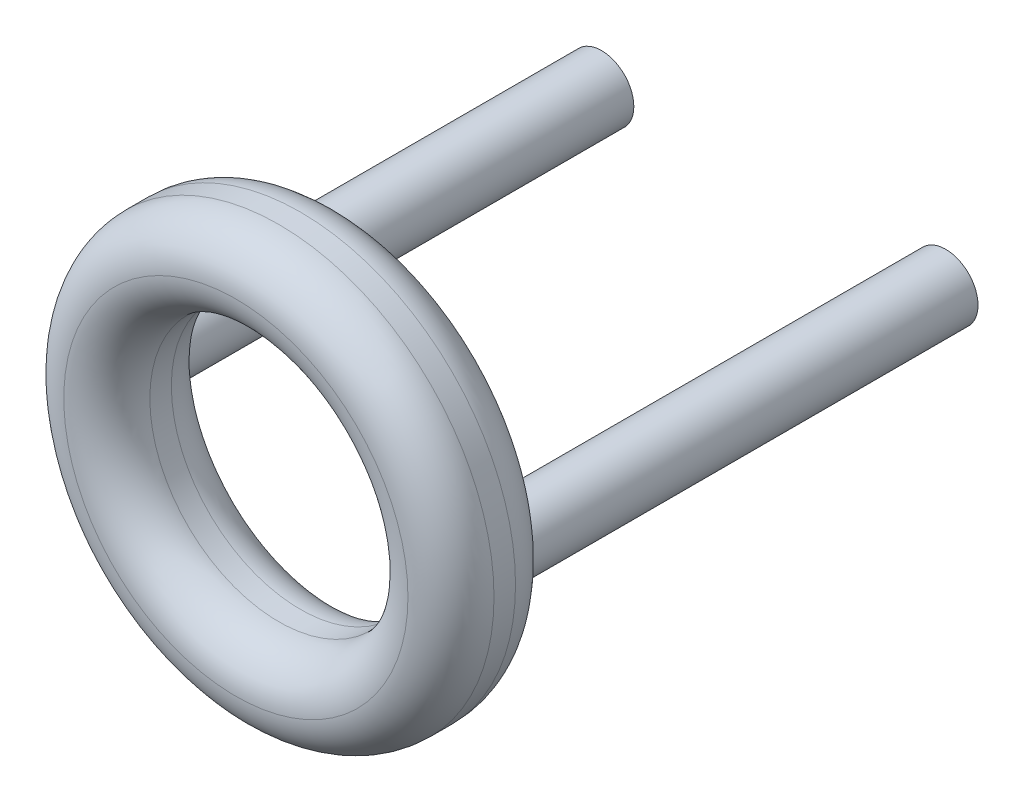
ISO-10303-21;
HEADER;
FILE_DESCRIPTION(('STEP AP214'),'2;1');
FILE_NAME('part.step','',(''),(''),'','','');
FILE_SCHEMA(('AUTOMOTIVE_DESIGN { 1 0 10303 214 1 1 1 1 }'));
ENDSEC;
DATA;
#1=APPLICATION_CONTEXT('core data for automotive mechanical design processes');
#2=APPLICATION_PROTOCOL_DEFINITION('international standard','automotive_design',2000,#1);
#3=PRODUCT_CONTEXT('',#1,'mechanical');
#4=PRODUCT('Part','Part','',(#3));
#5=PRODUCT_RELATED_PRODUCT_CATEGORY('part','',(#4));
#6=PRODUCT_DEFINITION_FORMATION('','',#4);
#7=PRODUCT_DEFINITION_CONTEXT('part definition',#1,'design');
#8=PRODUCT_DEFINITION('design','',#6,#7);
#9=PRODUCT_DEFINITION_SHAPE('','',#8);
#10=(LENGTH_UNIT() NAMED_UNIT(*) SI_UNIT(.MILLI.,.METRE.));
#11=(NAMED_UNIT(*) PLANE_ANGLE_UNIT() SI_UNIT($,.RADIAN.));
#12=(NAMED_UNIT(*) SI_UNIT($,.STERADIAN.) SOLID_ANGLE_UNIT());
#13=UNCERTAINTY_MEASURE_WITH_UNIT(LENGTH_MEASURE(1.E-05),#10,'distance_accuracy_value','');
#14=(GEOMETRIC_REPRESENTATION_CONTEXT(3) GLOBAL_UNCERTAINTY_ASSIGNED_CONTEXT((#13)) GLOBAL_UNIT_ASSIGNED_CONTEXT((#10,
#11,#12)) REPRESENTATION_CONTEXT('',''));
#15=CARTESIAN_POINT('',(0.,0.,0.));
#16=DIRECTION('',(0.,0.,1.));
#17=DIRECTION('',(1.,0.,0.));
#18=AXIS2_PLACEMENT_3D('',#15,#16,#17);
#19=CARTESIAN_POINT('',(0.,0.,25.));
#20=DIRECTION('',(0.,0.,-1.));
#21=DIRECTION('',(-1.,0.,0.));
#22=AXIS2_PLACEMENT_3D('',#19,#20,#21);
#23=CYLINDRICAL_SURFACE('',#22,50.);
#24=CARTESIAN_POINT('',(0.,0.,10.));
#25=DIRECTION('',(0.,0.,1.));
#26=DIRECTION('',(1.,0.,0.));
#27=AXIS2_PLACEMENT_3D('',#24,#25,#26);
#28=CIRCLE('',#27,50.);
#29=CARTESIAN_POINT('',(50.,0.,10.));
#30=VERTEX_POINT('',#29);
#31=EDGE_CURVE('E82',#30,#30,#28,.T.);
#32=ORIENTED_EDGE('',*,*,#31,.T.);
#33=EDGE_LOOP('',(#32));
#34=FACE_BOUND('',#33,.T.);
#35=CARTESIAN_POINT('',(0.,0.,15.));
#36=DIRECTION('',(0.,0.,1.));
#37=DIRECTION('',(1.,0.,0.));
#38=AXIS2_PLACEMENT_3D('',#35,#36,#37);
#39=CIRCLE('',#38,50.);
#40=CARTESIAN_POINT('',(50.,0.,15.));
#41=VERTEX_POINT('',#40);
#42=EDGE_CURVE('E149',#41,#41,#39,.F.);
#43=ORIENTED_EDGE('',*,*,#42,.T.);
#44=EDGE_LOOP('',(#43));
#45=FACE_BOUND('',#44,.T.);
#46=ADVANCED_FACE('F37',(#34,#45),#23,.T.);
#47=CARTESIAN_POINT('',(0.,0.,25.));
#48=DIRECTION('',(0.,0.,-1.));
#49=DIRECTION('',(-1.,0.,0.));
#50=AXIS2_PLACEMENT_3D('',#47,#48,#49);
#51=CYLINDRICAL_SURFACE('',#50,30.);
#52=CARTESIAN_POINT('',(0.,0.,10.));
#53=DIRECTION('',(0.,0.,1.));
#54=DIRECTION('',(1.,0.,0.));
#55=AXIS2_PLACEMENT_3D('',#52,#53,#54);
#56=CIRCLE('',#55,30.);
#57=CARTESIAN_POINT('',(30.,0.,10.));
#58=VERTEX_POINT('',#57);
#59=EDGE_CURVE('E74',#58,#58,#56,.F.);
#60=ORIENTED_EDGE('',*,*,#59,.T.);
#61=EDGE_LOOP('',(#60));
#62=FACE_BOUND('',#61,.T.);
#63=CARTESIAN_POINT('',(0.,0.,15.));
#64=DIRECTION('',(0.,0.,1.));
#65=DIRECTION('',(1.,0.,0.));
#66=AXIS2_PLACEMENT_3D('',#63,#64,#65);
#67=CIRCLE('',#66,30.);
#68=CARTESIAN_POINT('',(30.,0.,15.));
#69=VERTEX_POINT('',#68);
#70=EDGE_CURVE('E113',#69,#69,#67,.T.);
#71=ORIENTED_EDGE('',*,*,#70,.T.);
#72=EDGE_LOOP('',(#71));
#73=FACE_BOUND('',#72,.T.);
#74=ADVANCED_FACE('F117',(#62,#73),#51,.F.);
#75=CARTESIAN_POINT('',(-40.,0.,-100.));
#76=DIRECTION('',(0.,0.,1.));
#77=DIRECTION('',(1.,0.,0.));
#78=AXIS2_PLACEMENT_3D('',#75,#76,#77);
#79=CYLINDRICAL_SURFACE('',#78,7.5);
#80=CARTESIAN_POINT('',(-40.,0.,-100.));
#81=DIRECTION('',(0.,0.,1.));
#82=DIRECTION('',(1.,0.,0.));
#83=AXIS2_PLACEMENT_3D('',#80,#81,#82);
#84=CIRCLE('',#83,7.5);
#85=CARTESIAN_POINT('',(-32.5,0.,-100.));
#86=VERTEX_POINT('',#85);
#87=EDGE_CURVE('E152',#86,#86,#84,.T.);
#88=ORIENTED_EDGE('',*,*,#87,.T.);
#89=EDGE_LOOP('',(#88));
#90=FACE_BOUND('',#89,.T.);
#91=CARTESIAN_POINT('',(-39.296875,-7.46696827597218,0.));
#92=CARTESIAN_POINT('',(-39.4828433615517,-7.48452035154865,-3.83736356607891E-05));
#93=CARTESIAN_POINT('',(-39.6694359226315,-7.49504297331925,0.00518662248186173));
#94=CARTESIAN_POINT('',(-40.0422081473934,-7.50218514104267,0.0256502324255281));
#95=CARTESIAN_POINT('',(-40.2283880123181,-7.49881475823574,0.0408815857674367));
#96=CARTESIAN_POINT('',(-40.5977340455147,-7.478418737152,0.0807153281178335));
#97=CARTESIAN_POINT('',(-40.7809119656611,-7.46148267927572,0.105255687655519));
#98=CARTESIAN_POINT('',(-41.1441980802517,-7.41446943515852,0.163007286180664));
#99=CARTESIAN_POINT('',(-41.3243058351975,-7.3843903836237,0.196219755671169));
#100=CARTESIAN_POINT('',(-41.6797672765103,-7.3117160747166,0.270405288826198));
#101=CARTESIAN_POINT('',(-41.8551333411666,-7.26915773115464,0.311355339415414));
#102=CARTESIAN_POINT('',(-42.2007467341656,-7.17209695269338,0.400218388743584));
#103=CARTESIAN_POINT('',(-42.3709920310473,-7.11758984685219,0.44813410798763));
#104=CARTESIAN_POINT('',(-42.8731608600823,-6.93696161584904,0.601110308175253));
#105=CARTESIAN_POINT('',(-43.1963212135659,-6.79377461951817,0.715357387661439));
#106=CARTESIAN_POINT('',(-43.8435226612275,-6.45166796679128,0.972658450696581));
#107=CARTESIAN_POINT('',(-44.1647333694752,-6.24874713316809,1.11741772069651));
#108=CARTESIAN_POINT('',(-44.7699640229752,-5.79995331741055,1.41853360360408));
#109=CARTESIAN_POINT('',(-45.0539521421047,-5.55404399299704,1.57489996421992));
#110=CARTESIAN_POINT('',(-45.4720202747004,-5.13370342325031,1.8242629999697));
#111=CARTESIAN_POINT('',(-45.6194310501645,-4.97191604403373,1.91665016049628));
#112=CARTESIAN_POINT('',(-45.8999612275101,-4.63556029229111,2.10009533434255));
#113=CARTESIAN_POINT('',(-46.033077644282,-4.46098926289136,2.19115306661884));
#114=CARTESIAN_POINT('',(-46.2842239903363,-4.09962289171252,2.36960079504635));
#115=CARTESIAN_POINT('',(-46.4022593561802,-3.91283199199395,2.45699210523071));
#116=CARTESIAN_POINT('',(-46.6223677476853,-3.52753686773058,2.62549412969762));
#117=CARTESIAN_POINT('',(-46.7244462617831,-3.32903670314386,2.70660699861291));
#118=CARTESIAN_POINT('',(-46.9572389891968,-2.82102756588989,2.89696032566588));
#119=CARTESIAN_POINT('',(-47.077720913079,-2.50449820659589,3.00068444738192));
#120=CARTESIAN_POINT('',(-47.2265217586658,-2.01410141598239,3.13246557141737));
#121=CARTESIAN_POINT('',(-47.2707933201478,-1.84808677564434,3.17241680154093));
#122=CARTESIAN_POINT('',(-47.3481248233084,-1.51156087905157,3.24302160601089));
#123=CARTESIAN_POINT('',(-47.3811907911044,-1.34105209299326,3.27368017680174));
#124=CARTESIAN_POINT('',(-47.4358042817862,-0.994897396909216,3.32470609913635));
#125=CARTESIAN_POINT('',(-47.457234576801,-0.819217347511331,3.34496860352389));
#126=CARTESIAN_POINT('',(-47.4876204018837,-0.46581559637232,3.37379197625345));
#127=CARTESIAN_POINT('',(-47.4965763179319,-0.288093957973303,3.38235320665439));
#128=CARTESIAN_POINT('',(-47.5018039075852,0.0676611734173048,3.38734373365225));
#129=CARTESIAN_POINT('',(-47.4980788697896,0.245694573589969,3.38377617565363));
#130=CARTESIAN_POINT('',(-47.4780399936094,0.600392767856604,3.36469665473796));
#131=CARTESIAN_POINT('',(-47.4617266906087,0.777057619832734,3.34918519979969));
#132=CARTESIAN_POINT('',(-47.4198109437094,1.10452901468007,3.30973685409011));
#133=CARTESIAN_POINT('',(-47.3957018311239,1.25569650991975,3.28716666577849));
#134=CARTESIAN_POINT('',(-47.3386112331969,1.55500065313595,3.23433796676222));
#135=CARTESIAN_POINT('',(-47.3056265391811,1.7031361841238,3.20407667581237));
#136=CARTESIAN_POINT('',(-47.1939212455017,2.14209430047592,3.1030511223141));
#137=CARTESIAN_POINT('',(-47.1024512495441,2.42745463056976,3.02204697524747));
#138=CARTESIAN_POINT('',(-46.9188160266286,2.90271621755152,2.86590111872612));
#139=CARTESIAN_POINT('',(-46.8339147967494,3.09709940166745,2.79539115833151));
#140=CARTESIAN_POINT('',(-46.6492804035443,3.47583351745239,2.64691056184396));
#141=CARTESIAN_POINT('',(-46.5495416498972,3.66018063192564,2.56893711770603));
#142=CARTESIAN_POINT('',(-46.3360048397099,4.01853617634076,2.40786002827181));
#143=CARTESIAN_POINT('',(-46.2221868608313,4.192529428038,2.32474919857934));
#144=CARTESIAN_POINT('',(-45.9813108142928,4.52954856380252,2.15562259361708));
#145=CARTESIAN_POINT('',(-45.8542541306777,4.69257559141074,2.06960712264821));
#146=CARTESIAN_POINT('',(-45.5850757317455,5.01009135091931,1.89500131707354));
#147=CARTESIAN_POINT('',(-45.4427263713907,5.1643767956071,1.80639239126276));
#148=CARTESIAN_POINT('',(-45.1453804445496,5.46068763031003,1.62989953176074));
#149=CARTESIAN_POINT('',(-44.9903840834748,5.60271321937153,1.54201558631995));
#150=CARTESIAN_POINT('',(-44.6683034632097,5.87377382549731,1.36870290037893));
#151=CARTESIAN_POINT('',(-44.5012259839927,6.00281603312335,1.28327281980185));
#152=CARTESIAN_POINT('',(-44.1554207715133,6.24718261797653,1.11644885427996));
#153=CARTESIAN_POINT('',(-43.9766939635559,6.36250808267264,1.035054649668));
#154=CARTESIAN_POINT('',(-43.6272575189247,6.56731824300382,0.886043969206347));
#155=CARTESIAN_POINT('',(-43.4576273999268,6.65824170074795,0.817872856976212));
#156=CARTESIAN_POINT('',(-43.1101381208038,6.82747133482234,0.687284647566088));
#157=CARTESIAN_POINT('',(-42.9322826448453,6.90578309086092,0.624865011058986));
#158=CARTESIAN_POINT('',(-42.5693134518762,7.04887349765397,0.507041737898746));
#159=CARTESIAN_POINT('',(-42.3842121583237,7.11367420246447,0.451626726776997));
#160=CARTESIAN_POINT('',(-42.0075102201615,7.22901642959214,0.348911005161536));
#161=CARTESIAN_POINT('',(-41.8159128030983,7.27956491999605,0.301606333870003));
#162=CARTESIAN_POINT('',(-41.434847362526,7.36395303031043,0.217894985643583));
#163=CARTESIAN_POINT('',(-41.2455833531836,7.39836304124707,0.181137707376988));
#164=CARTESIAN_POINT('',(-40.8634237241821,7.45263319299253,0.117140476000725));
#165=CARTESIAN_POINT('',(-40.6705288644972,7.47249634462468,0.0898985540694818));
#166=CARTESIAN_POINT('',(-40.281012601454,7.49729225763067,0.0455887158806521));
#167=CARTESIAN_POINT('',(-40.08437377285,7.50210528200673,0.0286032551439178));
#168=CARTESIAN_POINT('',(-39.7890775717675,7.49768188151459,0.0115049225675571));
#169=CARTESIAN_POINT('',(-39.6905316700791,7.49426153326768,0.00720206137772249));
#170=CARTESIAN_POINT('',(-39.4935601407121,7.48353182313152,0.00144869026197761));
#171=CARTESIAN_POINT('',(-39.39513452416,7.47622212528213,-1.57320707648197E-06));
#172=CARTESIAN_POINT('',(-39.296875,7.46696827597218,0.));
#173=B_SPLINE_CURVE_WITH_KNOTS('',3,(#91,#92,#93,#94,#95,#96,#97,#98,#99,#100,#101,#102,#103,
#104,#105,#106,#107,#108,#109,#110,#111,#112,#113,#114,#115,#116,#117,#118,#119,#120,#121,#122,
#123,#124,#125,#126,#127,#128,#129,#130,#131,#132,#133,#134,#135,#136,#137,#138,#139,#140,#141,
#142,#143,#144,#145,#146,#147,#148,#149,#150,#151,#152,#153,#154,#155,#156,#157,#158,#159,#160,
#161,#162,#163,#164,#165,#166,#167,#168,#169,#170,#171,#172),.UNSPECIFIED.,.F.,.F.,(4,2,2,2,2,2,
2,2,2,2,2,2,2,2,2,2,2,2,2,2,2,2,2,2,2,2,2,2,2,2,2,2,2,2,2,2,2,2,2,2,4),(0.,0.560122047304853,
1.11983812545812,1.67588831337038,2.23201744327294,2.78651785524334,3.34123541712019,
4.4512783076623,5.66673003393851,6.88321431118526,7.59526570617166,8.30746551178006,
9.01940784803233,9.73110476688772,10.7890763127844,11.3177493963032,11.8461377184201,
12.3797551086666,12.9133559874363,13.4468184960332,13.9802583175058,14.4439551699429,
14.9078198824655,15.8355909191397,16.5054136119204,17.1754893154097,17.8465242726619,
18.5174891465984,19.2003809133729,19.8832615908901,20.5657619636599,21.2482081914038,
21.8601455114556,22.4718113480801,23.0824708095778,23.6928311922202,24.2795962038086,
24.8662397358794,25.4575388108966,25.7535334235083,26.0495536081442),.UNSPECIFIED.);
#174=CARTESIAN_POINT('',(-39.296875,-7.46696827597218,0.));
#175=VERTEX_POINT('',#174);
#176=CARTESIAN_POINT('',(-39.296875,7.46696827597218,0.));
#177=VERTEX_POINT('',#176);
#178=EDGE_CURVE('E58',#175,#177,#173,.T.);
#179=ORIENTED_EDGE('',*,*,#178,.T.);
#180=CARTESIAN_POINT('',(-39.296875,7.46696827597218,0.));
#181=CARTESIAN_POINT('',(-39.1161426886276,7.44998980399375,-4.23041557231891E-05));
#182=CARTESIAN_POINT('',(-38.9360476822339,7.42637325083257,0.00489719738267642));
#183=CARTESIAN_POINT('',(-38.5786488142297,7.36630286492063,0.0246328822237953));
#184=CARTESIAN_POINT('',(-38.4013436105896,7.32985541476325,0.0394241681182077));
#185=CARTESIAN_POINT('',(-38.0520528744001,7.24483512673809,0.0786226182207418));
#186=CARTESIAN_POINT('',(-37.8800393214081,7.19634662349656,0.102963557542882));
#187=CARTESIAN_POINT('',(-37.5413095940661,7.08776882851818,0.160881100178214));
#188=CARTESIAN_POINT('',(-37.3745937816466,7.0276787461614,0.194458332989054));
#189=CARTESIAN_POINT('',(-37.047830572793,6.89678354130436,0.270215604022961));
#190=CARTESIAN_POINT('',(-36.8877714954644,6.82599829356909,0.312379734793604));
#191=CARTESIAN_POINT('',(-36.5747652067918,6.6744303529777,0.404647873817085));
#192=CARTESIAN_POINT('',(-36.4218211370909,6.59364330038335,0.454755347222345));
#193=CARTESIAN_POINT('',(-36.1236201894087,6.42286756106054,0.562104372747657));
#194=CARTESIAN_POINT('',(-35.9783693976574,6.33287174944967,0.619351456443668));
#195=CARTESIAN_POINT('',(-35.6960816512706,6.14451718687103,0.740038567526594));
#196=CARTESIAN_POINT('',(-35.5590464428001,6.04615666871169,0.803479903979907));
#197=CARTESIAN_POINT('',(-35.2481397196032,5.80692061821335,0.958133257654476));
#198=CARTESIAN_POINT('',(-35.0776494669823,5.66298833276817,1.05143590567543));
#199=CARTESIAN_POINT('',(-34.7521786368705,5.3627816461185,1.24501673075821));
#200=CARTESIAN_POINT('',(-34.5972033170722,5.20650309290009,1.34529725309565));
#201=CARTESIAN_POINT('',(-34.3021975801722,4.88194081297046,1.55068096155294));
#202=CARTESIAN_POINT('',(-34.1622322657151,4.71360968450253,1.65580253590255));
#203=CARTESIAN_POINT('',(-33.8979578096703,4.36608959260525,1.86766255514281));
#204=CARTESIAN_POINT('',(-33.7736467490338,4.18690196406671,1.97440080004571));
#205=CARTESIAN_POINT('',(-33.5382793521879,3.81389811546805,2.18854897154051));
#206=CARTESIAN_POINT('',(-33.4275522882225,3.61985522544088,2.29592673240065));
#207=CARTESIAN_POINT('',(-33.2227284660258,3.2201006271461,2.50510238755272));
#208=CARTESIAN_POINT('',(-33.1286400709198,3.01438311907274,2.60689745817372));
#209=CARTESIAN_POINT('',(-32.9585426137403,2.59217696859957,2.79917407786933));
#210=CARTESIAN_POINT('',(-32.8824268271388,2.37576163908277,2.88972081690656));
#211=CARTESIAN_POINT('',(-32.749153914221,1.93103862395094,3.05378657646959));
#212=CARTESIAN_POINT('',(-32.6919685023627,1.70274927640134,3.12733095167242));
#213=CARTESIAN_POINT('',(-32.6206068813276,1.34554136823321,3.22122661503682));
#214=CARTESIAN_POINT('',(-32.5988529711124,1.22039441658589,3.25032622611199));
#215=CARTESIAN_POINT('',(-32.5615872187039,0.967633155219642,3.30065521814179));
#216=CARTESIAN_POINT('',(-32.5460727400452,0.840019911570272,3.32188792295031));
#217=CARTESIAN_POINT('',(-32.5215985531011,0.583201586367572,3.35557081750956));
#218=CARTESIAN_POINT('',(-32.5126290027413,0.453999193308049,3.36803419331138));
#219=CARTESIAN_POINT('',(-32.5014059681678,0.194731988989297,3.38365092580545));
#220=CARTESIAN_POINT('',(-32.4991525249047,0.0646671724763827,3.38680422573055));
#221=CARTESIAN_POINT('',(-32.5014178392176,-0.19547480018109,3.38364328786888));
#222=CARTESIAN_POINT('',(-32.5059464034875,-0.325551701710495,3.37731534031631));
#223=CARTESIAN_POINT('',(-32.5216862953839,-0.584512801651907,3.35547464917599));
#224=CARTESIAN_POINT('',(-32.5328976884509,-0.713396988371893,3.33996181564672));
#225=CARTESIAN_POINT('',(-32.5617830512127,-0.96929662383673,3.30042661951817));
#226=CARTESIAN_POINT('',(-32.5794664152454,-1.0963090754734,3.27639188861796));
#227=CARTESIAN_POINT('',(-32.6209789318803,-1.34770035429008,3.22077748103988));
#228=CARTESIAN_POINT('',(-32.6448117745101,-1.47207755151274,3.18919327509969));
#229=CARTESIAN_POINT('',(-32.710202415566,-1.77253831521789,3.10404541733885));
#230=CARTESIAN_POINT('',(-32.7549246780635,-1.94694008734821,3.04696176875361));
#231=CARTESIAN_POINT('',(-32.8555130895167,-2.28868250790179,2.92262726423552));
#232=CARTESIAN_POINT('',(-32.9113808114244,-2.45602215560849,2.85537497353304));
#233=CARTESIAN_POINT('',(-33.0337185146037,-2.78418464898494,2.71341388657352));
#234=CARTESIAN_POINT('',(-33.1002222627954,-2.94498462200988,2.63868163580236));
#235=CARTESIAN_POINT('',(-33.2431917512094,-3.25966357177122,2.48444989961629));
#236=CARTESIAN_POINT('',(-33.3196570479666,-3.41354285619062,2.40495062650314));
#237=CARTESIAN_POINT('',(-33.5112546559696,-3.76829856658714,2.21444291952458));
#238=CARTESIAN_POINT('',(-33.6304555688477,-3.96638035615548,2.10230210211001));
#239=CARTESIAN_POINT('',(-33.8864052243653,-4.35054428880397,1.87734613087307));
#240=CARTESIAN_POINT('',(-34.0231602077639,-4.53662212876096,1.76453075089835));
#241=CARTESIAN_POINT('',(-34.313985700548,-4.89618416521348,1.5420013642663));
#242=CARTESIAN_POINT('',(-34.4680303866368,-5.06968652255129,1.43228303081354));
#243=CARTESIAN_POINT('',(-34.7936156489814,-5.40350564448791,1.2190070439338));
#244=CARTESIAN_POINT('',(-34.9651491058279,-5.56382772694256,1.11544691056569));
#245=CARTESIAN_POINT('',(-35.2831008627135,-5.83382464148634,0.940794236562553));
#246=CARTESIAN_POINT('',(-35.4259104462311,-5.9465309084743,0.867801993640989));
#247=CARTESIAN_POINT('',(-35.7214619284487,-6.16259722422036,0.728427520876253));
#248=CARTESIAN_POINT('',(-35.8742014438852,-6.26595950147862,0.662043714565976));
#249=CARTESIAN_POINT('',(-36.1888979194759,-6.46218287905828,0.537227019768857));
#250=CARTESIAN_POINT('',(-36.3508348361398,-6.55506558957844,0.478777716776997));
#251=CARTESIAN_POINT('',(-36.6834740246763,-6.7294798286677,0.370819827992916));
#252=CARTESIAN_POINT('',(-36.8541717882149,-6.81101711699145,0.321306701731864));
#253=CARTESIAN_POINT('',(-37.2046542830465,-6.96223427439103,0.231870836498628));
#254=CARTESIAN_POINT('',(-37.3844931521091,-7.03182928329618,0.19201596530391));
#255=CARTESIAN_POINT('',(-37.7508558788783,-7.15743323990798,0.12315079764103));
#256=CARTESIAN_POINT('',(-37.9373790918652,-7.21344349386804,0.0941394583587798));
#257=CARTESIAN_POINT('',(-38.3174777426869,-7.31149732703702,0.0472716475570189));
#258=CARTESIAN_POINT('',(-38.511104665283,-7.35339737584432,0.0295282742686749));
#259=CARTESIAN_POINT('',(-38.8041050994161,-7.40470784545471,0.0117987572718843));
#260=CARTESIAN_POINT('',(-38.9022485887133,-7.41989279722667,0.00736985357594758));
#261=CARTESIAN_POINT('',(-39.0991524640816,-7.44636437289765,0.0014695897001808));
#262=CARTESIAN_POINT('',(-39.1979128755881,-7.45765083497027,-1.64771905834302E-06));
#263=CARTESIAN_POINT('',(-39.296875,-7.46696827597218,0.));
#264=B_SPLINE_CURVE_WITH_KNOTS('',3,(#180,#181,#182,#183,#184,#185,#186,#187,#188,#189,#190,
#191,#192,#193,#194,#195,#196,#197,#198,#199,#200,#201,#202,#203,#204,#205,#206,#207,#208,#209,
#210,#211,#212,#213,#214,#215,#216,#217,#218,#219,#220,#221,#222,#223,#224,#225,#226,#227,#228,
#229,#230,#231,#232,#233,#234,#235,#236,#237,#238,#239,#240,#241,#242,#243,#244,#245,#246,#247,
#248,#249,#250,#251,#252,#253,#254,#255,#256,#257,#258,#259,#260,#261,#262,#263),.UNSPECIFIED.,
.F.,.F.,(4,2,2,2,2,2,2,2,2,2,2,2,2,2,2,2,2,2,2,2,2,2,2,2,2,2,2,2,2,2,2,2,2,2,2,2,2,2,2,2,2,4),
(0.,0.544375589475484,1.08848076684839,1.62887755122925,2.16931117536911,2.70875259333029,
3.24842998459188,3.7885281314709,4.32874066842187,5.05324056405254,5.77798515262442,
6.50575583366609,7.23343721055521,7.97624614665752,8.7194273875271,9.45807778502581,
10.1956194650407,10.5862174681038,10.9766502505363,11.3664946945892,11.7563415156705,
12.1467525946917,12.5371674968141,12.9281513648343,13.3193703926532,13.885087770171,
14.4508850435925,15.0185156149226,15.5861209252864,16.3560073961442,17.1261683362553,
17.8951939249518,18.6639076957604,19.2514507276716,19.8388532614358,20.4250214589565,
21.0108909809251,21.6007651701226,22.1905826169702,22.7862302871671,23.0843541353887,
23.3824903572525),.UNSPECIFIED.);
#265=EDGE_CURVE('E11',#177,#175,#264,.T.);
#266=ORIENTED_EDGE('',*,*,#265,.T.);
#267=EDGE_LOOP('',(#179,#266));
#268=FACE_BOUND('',#267,.T.);
#269=ADVANCED_FACE('F135',(#90,#268),#79,.T.);
#270=CARTESIAN_POINT('',(-40.,0.,-100.));
#271=DIRECTION('',(0.,0.,1.));
#272=DIRECTION('',(1.,0.,0.));
#273=AXIS2_PLACEMENT_3D('',#270,#271,#272);
#274=PLANE('',#273);
#275=ORIENTED_EDGE('',*,*,#87,.F.);
#276=EDGE_LOOP('',(#275));
#277=FACE_BOUND('',#276,.T.);
#278=ADVANCED_FACE('F103',(#277),#274,.F.);
#279=CARTESIAN_POINT('',(40.,0.,-100.));
#280=DIRECTION('',(0.,0.,1.));
#281=DIRECTION('',(1.,0.,0.));
#282=AXIS2_PLACEMENT_3D('',#279,#280,#281);
#283=CYLINDRICAL_SURFACE('',#282,7.5);
#284=CARTESIAN_POINT('',(40.,0.,-100.));
#285=DIRECTION('',(0.,0.,1.));
#286=DIRECTION('',(1.,0.,0.));
#287=AXIS2_PLACEMENT_3D('',#284,#285,#286);
#288=CIRCLE('',#287,7.5);
#289=CARTESIAN_POINT('',(47.5,0.,-100.));
#290=VERTEX_POINT('',#289);
#291=EDGE_CURVE('E156',#290,#290,#288,.T.);
#292=ORIENTED_EDGE('',*,*,#291,.T.);
#293=EDGE_LOOP('',(#292));
#294=FACE_BOUND('',#293,.T.);
#295=CARTESIAN_POINT('',(39.296875,7.46696827597218,0.));
#296=CARTESIAN_POINT('',(39.4828433615517,7.48452035154865,-3.83736356607891E-05));
#297=CARTESIAN_POINT('',(39.6694359226315,7.49504297331925,0.00518662248186173));
#298=CARTESIAN_POINT('',(40.0422081473934,7.50218514104267,0.0256502324255281));
#299=CARTESIAN_POINT('',(40.2283880123181,7.49881475823574,0.0408815857674367));
#300=CARTESIAN_POINT('',(40.5977340455147,7.478418737152,0.0807153281178335));
#301=CARTESIAN_POINT('',(40.7809119656611,7.46148267927572,0.105255687655519));
#302=CARTESIAN_POINT('',(41.1441980802517,7.41446943515852,0.163007286180664));
#303=CARTESIAN_POINT('',(41.3243058351975,7.3843903836237,0.196219755671169));
#304=CARTESIAN_POINT('',(41.6797672765103,7.3117160747166,0.270405288826198));
#305=CARTESIAN_POINT('',(41.8551333411666,7.26915773115464,0.311355339415414));
#306=CARTESIAN_POINT('',(42.2007467341656,7.17209695269338,0.400218388743584));
#307=CARTESIAN_POINT('',(42.3709920310473,7.11758984685219,0.44813410798763));
#308=CARTESIAN_POINT('',(42.8731608600823,6.93696161584904,0.601110308175253));
#309=CARTESIAN_POINT('',(43.1963212135659,6.79377461951817,0.715357387661439));
#310=CARTESIAN_POINT('',(43.8435226612275,6.45166796679128,0.972658450696581));
#311=CARTESIAN_POINT('',(44.1647333694752,6.24874713316809,1.11741772069651));
#312=CARTESIAN_POINT('',(44.7699640229752,5.79995331741055,1.41853360360408));
#313=CARTESIAN_POINT('',(45.0539521421047,5.55404399299704,1.57489996421992));
#314=CARTESIAN_POINT('',(45.4720202747004,5.13370342325031,1.8242629999697));
#315=CARTESIAN_POINT('',(45.6194310501645,4.97191604403373,1.91665016049628));
#316=CARTESIAN_POINT('',(45.8999612275101,4.63556029229111,2.10009533434255));
#317=CARTESIAN_POINT('',(46.033077644282,4.46098926289136,2.19115306661884));
#318=CARTESIAN_POINT('',(46.2842239903363,4.09962289171252,2.36960079504635));
#319=CARTESIAN_POINT('',(46.4022593561802,3.91283199199395,2.45699210523071));
#320=CARTESIAN_POINT('',(46.6223677476853,3.52753686773058,2.62549412969762));
#321=CARTESIAN_POINT('',(46.7244462617831,3.32903670314386,2.70660699861291));
#322=CARTESIAN_POINT('',(46.9572389891968,2.82102756588989,2.89696032566588));
#323=CARTESIAN_POINT('',(47.077720913079,2.50449820659589,3.00068444738192));
#324=CARTESIAN_POINT('',(47.2265217586658,2.01410141598239,3.13246557141737));
#325=CARTESIAN_POINT('',(47.2707933201478,1.84808677564434,3.17241680154093));
#326=CARTESIAN_POINT('',(47.3481248233084,1.51156087905157,3.24302160601089));
#327=CARTESIAN_POINT('',(47.3811907911044,1.34105209299326,3.27368017680174));
#328=CARTESIAN_POINT('',(47.4358042817862,0.994897396909216,3.32470609913635));
#329=CARTESIAN_POINT('',(47.457234576801,0.819217347511331,3.34496860352389));
#330=CARTESIAN_POINT('',(47.4876204018837,0.46581559637232,3.37379197625345));
#331=CARTESIAN_POINT('',(47.4965763179319,0.288093957973303,3.38235320665439));
#332=CARTESIAN_POINT('',(47.5018039075852,-0.0676611734173048,3.38734373365225));
#333=CARTESIAN_POINT('',(47.4980788697896,-0.245694573589969,3.38377617565363));
#334=CARTESIAN_POINT('',(47.4780399936094,-0.600392767856604,3.36469665473796));
#335=CARTESIAN_POINT('',(47.4617266906087,-0.777057619832734,3.34918519979969));
#336=CARTESIAN_POINT('',(47.4198109437094,-1.10452901468007,3.30973685409011));
#337=CARTESIAN_POINT('',(47.3957018311239,-1.25569650991975,3.28716666577849));
#338=CARTESIAN_POINT('',(47.3386112331969,-1.55500065313595,3.23433796676222));
#339=CARTESIAN_POINT('',(47.3056265391811,-1.7031361841238,3.20407667581237));
#340=CARTESIAN_POINT('',(47.1939212455017,-2.14209430047592,3.1030511223141));
#341=CARTESIAN_POINT('',(47.1024512495441,-2.42745463056976,3.02204697524747));
#342=CARTESIAN_POINT('',(46.9188160266286,-2.90271621755152,2.86590111872612));
#343=CARTESIAN_POINT('',(46.8339147967494,-3.09709940166745,2.79539115833151));
#344=CARTESIAN_POINT('',(46.6492804035443,-3.47583351745239,2.64691056184396));
#345=CARTESIAN_POINT('',(46.5495416498972,-3.66018063192564,2.56893711770603));
#346=CARTESIAN_POINT('',(46.3360048397099,-4.01853617634076,2.40786002827181));
#347=CARTESIAN_POINT('',(46.2221868608313,-4.192529428038,2.32474919857934));
#348=CARTESIAN_POINT('',(45.9813108142928,-4.52954856380252,2.15562259361708));
#349=CARTESIAN_POINT('',(45.8542541306777,-4.69257559141074,2.06960712264821));
#350=CARTESIAN_POINT('',(45.5850757317455,-5.01009135091931,1.89500131707354));
#351=CARTESIAN_POINT('',(45.4427263713907,-5.1643767956071,1.80639239126276));
#352=CARTESIAN_POINT('',(45.1453804445496,-5.46068763031003,1.62989953176074));
#353=CARTESIAN_POINT('',(44.9903840834748,-5.60271321937153,1.54201558631995));
#354=CARTESIAN_POINT('',(44.6683034632097,-5.87377382549731,1.36870290037893));
#355=CARTESIAN_POINT('',(44.5012259839927,-6.00281603312335,1.28327281980185));
#356=CARTESIAN_POINT('',(44.1554207715133,-6.24718261797653,1.11644885427996));
#357=CARTESIAN_POINT('',(43.9766939635559,-6.36250808267264,1.035054649668));
#358=CARTESIAN_POINT('',(43.6272575189247,-6.56731824300382,0.886043969206347));
#359=CARTESIAN_POINT('',(43.4576273999268,-6.65824170074795,0.817872856976212));
#360=CARTESIAN_POINT('',(43.1101381208038,-6.82747133482234,0.687284647566088));
#361=CARTESIAN_POINT('',(42.9322826448453,-6.90578309086092,0.624865011058986));
#362=CARTESIAN_POINT('',(42.5693134518762,-7.04887349765397,0.507041737898746));
#363=CARTESIAN_POINT('',(42.3842121583237,-7.11367420246447,0.451626726776997));
#364=CARTESIAN_POINT('',(42.0075102201615,-7.22901642959214,0.348911005161536));
#365=CARTESIAN_POINT('',(41.8159128030983,-7.27956491999605,0.301606333870003));
#366=CARTESIAN_POINT('',(41.434847362526,-7.36395303031043,0.217894985643583));
#367=CARTESIAN_POINT('',(41.2455833531836,-7.39836304124707,0.181137707376988));
#368=CARTESIAN_POINT('',(40.8634237241821,-7.45263319299253,0.117140476000725));
#369=CARTESIAN_POINT('',(40.6705288644972,-7.47249634462468,0.0898985540694818));
#370=CARTESIAN_POINT('',(40.281012601454,-7.49729225763067,0.0455887158806521));
#371=CARTESIAN_POINT('',(40.08437377285,-7.50210528200673,0.0286032551439178));
#372=CARTESIAN_POINT('',(39.7890775717675,-7.49768188151459,0.0115049225675571));
#373=CARTESIAN_POINT('',(39.6905316700791,-7.49426153326768,0.00720206137772249));
#374=CARTESIAN_POINT('',(39.4935601407121,-7.48353182313152,0.00144869026197761));
#375=CARTESIAN_POINT('',(39.39513452416,-7.47622212528213,-1.57320707648197E-06));
#376=CARTESIAN_POINT('',(39.296875,-7.46696827597218,0.));
#377=B_SPLINE_CURVE_WITH_KNOTS('',3,(#295,#296,#297,#298,#299,#300,#301,#302,#303,#304,#305,
#306,#307,#308,#309,#310,#311,#312,#313,#314,#315,#316,#317,#318,#319,#320,#321,#322,#323,#324,
#325,#326,#327,#328,#329,#330,#331,#332,#333,#334,#335,#336,#337,#338,#339,#340,#341,#342,#343,
#344,#345,#346,#347,#348,#349,#350,#351,#352,#353,#354,#355,#356,#357,#358,#359,#360,#361,#362,
#363,#364,#365,#366,#367,#368,#369,#370,#371,#372,#373,#374,#375,#376),.UNSPECIFIED.,.F.,.F.,(4,
2,2,2,2,2,2,2,2,2,2,2,2,2,2,2,2,2,2,2,2,2,2,2,2,2,2,2,2,2,2,2,2,2,2,2,2,2,2,2,4),(0.,
0.560122047304853,1.11983812545812,1.67588831337038,2.23201744327294,2.78651785524334,
3.34123541712019,4.4512783076623,5.66673003393851,6.88321431118526,7.59526570617166,
8.30746551178006,9.01940784803233,9.73110476688772,10.7890763127844,11.3177493963032,
11.8461377184201,12.3797551086666,12.9133559874363,13.4468184960332,13.9802583175058,
14.4439551699429,14.9078198824655,15.8355909191397,16.5054136119204,17.1754893154097,
17.8465242726619,18.5174891465984,19.2003809133729,19.8832615908901,20.5657619636599,
21.2482081914038,21.8601455114556,22.4718113480801,23.0824708095778,23.6928311922202,
24.2795962038086,24.8662397358794,25.4575388108966,25.7535334235083,26.0495536081442),.UNSPECIFIED.);
#378=CARTESIAN_POINT('',(39.296875,7.46696827597218,0.));
#379=VERTEX_POINT('',#378);
#380=CARTESIAN_POINT('',(39.296875,-7.46696827597218,0.));
#381=VERTEX_POINT('',#380);
#382=EDGE_CURVE('E69',#379,#381,#377,.T.);
#383=ORIENTED_EDGE('',*,*,#382,.T.);
#384=CARTESIAN_POINT('',(39.296875,-7.46696827597218,0.));
#385=CARTESIAN_POINT('',(39.1161426886276,-7.44998980399375,-4.23041557231891E-05));
#386=CARTESIAN_POINT('',(38.9360476822339,-7.42637325083257,0.00489719738267642));
#387=CARTESIAN_POINT('',(38.5786488142297,-7.36630286492063,0.0246328822237953));
#388=CARTESIAN_POINT('',(38.4013436105896,-7.32985541476325,0.0394241681182077));
#389=CARTESIAN_POINT('',(38.0520528744001,-7.24483512673809,0.0786226182207418));
#390=CARTESIAN_POINT('',(37.8800393214081,-7.19634662349656,0.102963557542882));
#391=CARTESIAN_POINT('',(37.5413095940661,-7.08776882851818,0.160881100178214));
#392=CARTESIAN_POINT('',(37.3745937816466,-7.0276787461614,0.194458332989054));
#393=CARTESIAN_POINT('',(37.047830572793,-6.89678354130436,0.270215604022961));
#394=CARTESIAN_POINT('',(36.8877714954644,-6.82599829356909,0.312379734793604));
#395=CARTESIAN_POINT('',(36.5747652067918,-6.6744303529777,0.404647873817085));
#396=CARTESIAN_POINT('',(36.4218211370909,-6.59364330038335,0.454755347222345));
#397=CARTESIAN_POINT('',(36.1236201894087,-6.42286756106054,0.562104372747657));
#398=CARTESIAN_POINT('',(35.9783693976574,-6.33287174944967,0.619351456443668));
#399=CARTESIAN_POINT('',(35.6960816512706,-6.14451718687103,0.740038567526594));
#400=CARTESIAN_POINT('',(35.5590464428001,-6.04615666871169,0.803479903979907));
#401=CARTESIAN_POINT('',(35.2481397196032,-5.80692061821335,0.958133257654476));
#402=CARTESIAN_POINT('',(35.0776494669823,-5.66298833276817,1.05143590567543));
#403=CARTESIAN_POINT('',(34.7521786368705,-5.3627816461185,1.24501673075821));
#404=CARTESIAN_POINT('',(34.5972033170722,-5.20650309290009,1.34529725309565));
#405=CARTESIAN_POINT('',(34.3021975801722,-4.88194081297046,1.55068096155294));
#406=CARTESIAN_POINT('',(34.1622322657151,-4.71360968450253,1.65580253590255));
#407=CARTESIAN_POINT('',(33.8979578096703,-4.36608959260525,1.86766255514281));
#408=CARTESIAN_POINT('',(33.7736467490338,-4.18690196406671,1.97440080004571));
#409=CARTESIAN_POINT('',(33.5382793521879,-3.81389811546805,2.18854897154051));
#410=CARTESIAN_POINT('',(33.4275522882225,-3.61985522544088,2.29592673240065));
#411=CARTESIAN_POINT('',(33.2227284660258,-3.2201006271461,2.50510238755272));
#412=CARTESIAN_POINT('',(33.1286400709198,-3.01438311907274,2.60689745817372));
#413=CARTESIAN_POINT('',(32.9585426137403,-2.59217696859957,2.79917407786933));
#414=CARTESIAN_POINT('',(32.8824268271388,-2.37576163908277,2.88972081690656));
#415=CARTESIAN_POINT('',(32.749153914221,-1.93103862395094,3.05378657646959));
#416=CARTESIAN_POINT('',(32.6919685023627,-1.70274927640134,3.12733095167242));
#417=CARTESIAN_POINT('',(32.6206068813276,-1.34554136823321,3.22122661503682));
#418=CARTESIAN_POINT('',(32.5988529711124,-1.22039441658589,3.25032622611199));
#419=CARTESIAN_POINT('',(32.5615872187039,-0.967633155219642,3.30065521814179));
#420=CARTESIAN_POINT('',(32.5460727400452,-0.840019911570272,3.32188792295031));
#421=CARTESIAN_POINT('',(32.5215985531011,-0.583201586367572,3.35557081750956));
#422=CARTESIAN_POINT('',(32.5126290027413,-0.453999193308049,3.36803419331138));
#423=CARTESIAN_POINT('',(32.5014059681678,-0.194731988989297,3.38365092580545));
#424=CARTESIAN_POINT('',(32.4991525249047,-0.0646671724763827,3.38680422573055));
#425=CARTESIAN_POINT('',(32.5014178392176,0.19547480018109,3.38364328786888));
#426=CARTESIAN_POINT('',(32.5059464034875,0.325551701710495,3.37731534031631));
#427=CARTESIAN_POINT('',(32.5216862953839,0.584512801651907,3.35547464917599));
#428=CARTESIAN_POINT('',(32.5328976884509,0.713396988371893,3.33996181564672));
#429=CARTESIAN_POINT('',(32.5617830512127,0.96929662383673,3.30042661951817));
#430=CARTESIAN_POINT('',(32.5794664152454,1.0963090754734,3.27639188861796));
#431=CARTESIAN_POINT('',(32.6209789318803,1.34770035429008,3.22077748103988));
#432=CARTESIAN_POINT('',(32.6448117745101,1.47207755151274,3.18919327509969));
#433=CARTESIAN_POINT('',(32.710202415566,1.77253831521789,3.10404541733885));
#434=CARTESIAN_POINT('',(32.7549246780635,1.94694008734821,3.04696176875361));
#435=CARTESIAN_POINT('',(32.8555130895167,2.28868250790179,2.92262726423552));
#436=CARTESIAN_POINT('',(32.9113808114244,2.45602215560849,2.85537497353304));
#437=CARTESIAN_POINT('',(33.0337185146037,2.78418464898494,2.71341388657352));
#438=CARTESIAN_POINT('',(33.1002222627954,2.94498462200988,2.63868163580236));
#439=CARTESIAN_POINT('',(33.2431917512094,3.25966357177122,2.48444989961629));
#440=CARTESIAN_POINT('',(33.3196570479666,3.41354285619062,2.40495062650314));
#441=CARTESIAN_POINT('',(33.5112546559696,3.76829856658714,2.21444291952458));
#442=CARTESIAN_POINT('',(33.6304555688477,3.96638035615548,2.10230210211001));
#443=CARTESIAN_POINT('',(33.8864052243653,4.35054428880397,1.87734613087307));
#444=CARTESIAN_POINT('',(34.0231602077639,4.53662212876096,1.76453075089835));
#445=CARTESIAN_POINT('',(34.313985700548,4.89618416521348,1.5420013642663));
#446=CARTESIAN_POINT('',(34.4680303866368,5.06968652255129,1.43228303081354));
#447=CARTESIAN_POINT('',(34.7936156489814,5.40350564448791,1.2190070439338));
#448=CARTESIAN_POINT('',(34.9651491058279,5.56382772694256,1.11544691056569));
#449=CARTESIAN_POINT('',(35.2831008627135,5.83382464148634,0.940794236562553));
#450=CARTESIAN_POINT('',(35.4259104462311,5.9465309084743,0.867801993640989));
#451=CARTESIAN_POINT('',(35.7214619284487,6.16259722422036,0.728427520876253));
#452=CARTESIAN_POINT('',(35.8742014438852,6.26595950147862,0.662043714565976));
#453=CARTESIAN_POINT('',(36.1888979194759,6.46218287905828,0.537227019768857));
#454=CARTESIAN_POINT('',(36.3508348361398,6.55506558957844,0.478777716776997));
#455=CARTESIAN_POINT('',(36.6834740246763,6.7294798286677,0.370819827992916));
#456=CARTESIAN_POINT('',(36.8541717882149,6.81101711699145,0.321306701731864));
#457=CARTESIAN_POINT('',(37.2046542830465,6.96223427439103,0.231870836498628));
#458=CARTESIAN_POINT('',(37.3844931521091,7.03182928329618,0.19201596530391));
#459=CARTESIAN_POINT('',(37.7508558788783,7.15743323990798,0.12315079764103));
#460=CARTESIAN_POINT('',(37.9373790918652,7.21344349386804,0.0941394583587788));
#461=CARTESIAN_POINT('',(38.3174777426869,7.31149732703702,0.0472716475570188));
#462=CARTESIAN_POINT('',(38.511104665283,7.35339737584432,0.0295282742686765));
#463=CARTESIAN_POINT('',(38.8041050994161,7.40470784545472,0.0117987572718852));
#464=CARTESIAN_POINT('',(38.9022485887133,7.41989279722667,0.00736985357594771));
#465=CARTESIAN_POINT('',(39.0991524640816,7.44636437289765,0.00146958970017989));
#466=CARTESIAN_POINT('',(39.1979128755881,7.45765083497027,-1.64771905937547E-06));
#467=CARTESIAN_POINT('',(39.296875,7.46696827597218,0.));
#468=B_SPLINE_CURVE_WITH_KNOTS('',3,(#384,#385,#386,#387,#388,#389,#390,#391,#392,#393,#394,
#395,#396,#397,#398,#399,#400,#401,#402,#403,#404,#405,#406,#407,#408,#409,#410,#411,#412,#413,
#414,#415,#416,#417,#418,#419,#420,#421,#422,#423,#424,#425,#426,#427,#428,#429,#430,#431,#432,
#433,#434,#435,#436,#437,#438,#439,#440,#441,#442,#443,#444,#445,#446,#447,#448,#449,#450,#451,
#452,#453,#454,#455,#456,#457,#458,#459,#460,#461,#462,#463,#464,#465,#466,#467),.UNSPECIFIED.,
.F.,.F.,(4,2,2,2,2,2,2,2,2,2,2,2,2,2,2,2,2,2,2,2,2,2,2,2,2,2,2,2,2,2,2,2,2,2,2,2,2,2,2,2,2,4),
(0.,0.544375589475484,1.08848076684839,1.62887755122925,2.16931117536911,2.70875259333029,
3.24842998459188,3.7885281314709,4.32874066842187,5.05324056405254,5.77798515262442,
6.50575583366609,7.23343721055521,7.97624614665752,8.7194273875271,9.45807778502581,
10.1956194650407,10.5862174681038,10.9766502505363,11.3664946945892,11.7563415156705,
12.1467525946917,12.5371674968141,12.9281513648343,13.3193703926532,13.885087770171,
14.4508850435925,15.0185156149226,15.5861209252864,16.3560073961442,17.1261683362553,
17.8951939249518,18.6639076957604,19.2514507276716,19.8388532614358,20.4250214589565,
21.0108909809251,21.6007651701226,22.1905826169702,22.7862302871671,23.0843541353887,
23.3824903572525),.UNSPECIFIED.);
#469=EDGE_CURVE('E51',#381,#379,#468,.T.);
#470=ORIENTED_EDGE('',*,*,#469,.T.);
#471=EDGE_LOOP('',(#383,#470));
#472=FACE_BOUND('',#471,.T.);
#473=ADVANCED_FACE('F68',(#294,#472),#283,.T.);
#474=CARTESIAN_POINT('',(40.,0.,-100.));
#475=DIRECTION('',(0.,0.,1.));
#476=DIRECTION('',(1.,0.,0.));
#477=AXIS2_PLACEMENT_3D('',#474,#475,#476);
#478=PLANE('',#477);
#479=ORIENTED_EDGE('',*,*,#291,.F.);
#480=EDGE_LOOP('',(#479));
#481=FACE_BOUND('',#480,.T.);
#482=ADVANCED_FACE('F102',(#481),#478,.F.);
#483=CARTESIAN_POINT('',(0.,0.,15.));
#484=DIRECTION('',(0.,0.,1.));
#485=DIRECTION('',(1.,0.,0.));
#486=AXIS2_PLACEMENT_3D('',#483,#484,#485);
#487=TOROIDAL_SURFACE('',#486,40.,10.);
#488=ORIENTED_EDGE('',*,*,#42,.F.);
#489=EDGE_LOOP('',(#488));
#490=FACE_BOUND('',#489,.T.);
#491=CARTESIAN_POINT('',(0.,0.,25.));
#492=DIRECTION('',(0.,0.,1.));
#493=DIRECTION('',(1.,0.,0.));
#494=AXIS2_PLACEMENT_3D('',#491,#492,#493);
#495=CIRCLE('',#494,40.);
#496=CARTESIAN_POINT('',(40.,0.,25.));
#497=VERTEX_POINT('',#496);
#498=EDGE_CURVE('E151',#497,#497,#495,.T.);
#499=ORIENTED_EDGE('',*,*,#498,.F.);
#500=EDGE_LOOP('',(#499));
#501=FACE_BOUND('',#500,.T.);
#502=ADVANCED_FACE('F127',(#490,#501),#487,.T.);
#503=CARTESIAN_POINT('',(0.,0.,10.));
#504=DIRECTION('',(0.,0.,1.));
#505=DIRECTION('',(1.,0.,0.));
#506=AXIS2_PLACEMENT_3D('',#503,#504,#505);
#507=TOROIDAL_SURFACE('',#506,40.,10.);
#508=ORIENTED_EDGE('',*,*,#382,.F.);
#509=CARTESIAN_POINT('',(0.,0.,0.));
#510=DIRECTION('',(0.,0.,1.));
#511=DIRECTION('',(1.,0.,0.));
#512=AXIS2_PLACEMENT_3D('',#509,#510,#511);
#513=CIRCLE('',#512,40.);
#514=EDGE_CURVE('E78',#177,#379,#513,.F.);
#515=ORIENTED_EDGE('',*,*,#514,.F.);
#516=ORIENTED_EDGE('',*,*,#178,.F.);
#517=CARTESIAN_POINT('',(0.,0.,0.));
#518=DIRECTION('',(0.,0.,1.));
#519=DIRECTION('',(1.,0.,0.));
#520=AXIS2_PLACEMENT_3D('',#517,#518,#519);
#521=CIRCLE('',#520,40.);
#522=EDGE_CURVE('E79',#381,#175,#521,.F.);
#523=ORIENTED_EDGE('',*,*,#522,.F.);
#524=EDGE_LOOP('',(#508,#515,#516,#523));
#525=FACE_BOUND('',#524,.T.);
#526=ORIENTED_EDGE('',*,*,#31,.F.);
#527=EDGE_LOOP('',(#526));
#528=FACE_BOUND('',#527,.T.);
#529=ADVANCED_FACE('F76',(#525,#528),#507,.T.);
#530=CARTESIAN_POINT('',(0.,0.,15.));
#531=DIRECTION('',(0.,0.,1.));
#532=DIRECTION('',(1.,0.,0.));
#533=AXIS2_PLACEMENT_3D('',#530,#531,#532);
#534=TOROIDAL_SURFACE('',#533,40.,10.);
#535=ORIENTED_EDGE('',*,*,#498,.T.);
#536=EDGE_LOOP('',(#535));
#537=FACE_BOUND('',#536,.T.);
#538=ORIENTED_EDGE('',*,*,#70,.F.);
#539=EDGE_LOOP('',(#538));
#540=FACE_BOUND('',#539,.T.);
#541=ADVANCED_FACE('F119',(#537,#540),#534,.T.);
#542=CARTESIAN_POINT('',(0.,0.,10.));
#543=DIRECTION('',(0.,0.,1.));
#544=DIRECTION('',(1.,0.,0.));
#545=AXIS2_PLACEMENT_3D('',#542,#543,#544);
#546=TOROIDAL_SURFACE('',#545,40.,10.);
#547=ORIENTED_EDGE('',*,*,#59,.F.);
#548=EDGE_LOOP('',(#547));
#549=FACE_BOUND('',#548,.T.);
#550=ORIENTED_EDGE('',*,*,#469,.F.);
#551=ORIENTED_EDGE('',*,*,#522,.T.);
#552=ORIENTED_EDGE('',*,*,#265,.F.);
#553=ORIENTED_EDGE('',*,*,#514,.T.);
#554=EDGE_LOOP('',(#550,#551,#552,#553));
#555=FACE_BOUND('',#554,.T.);
#556=ADVANCED_FACE('F39',(#549,#555),#546,.T.);
#557=CLOSED_SHELL('',(#46,#74,#269,#278,#473,#482,#502,#529,#541,#556));
#558=MANIFOLD_SOLID_BREP('B2',#557);
#559=ADVANCED_BREP_SHAPE_REPRESENTATION('',(#18,#558),#14);
#560=SHAPE_DEFINITION_REPRESENTATION(#9,#559);
ENDSEC;
END-ISO-10303-21;
